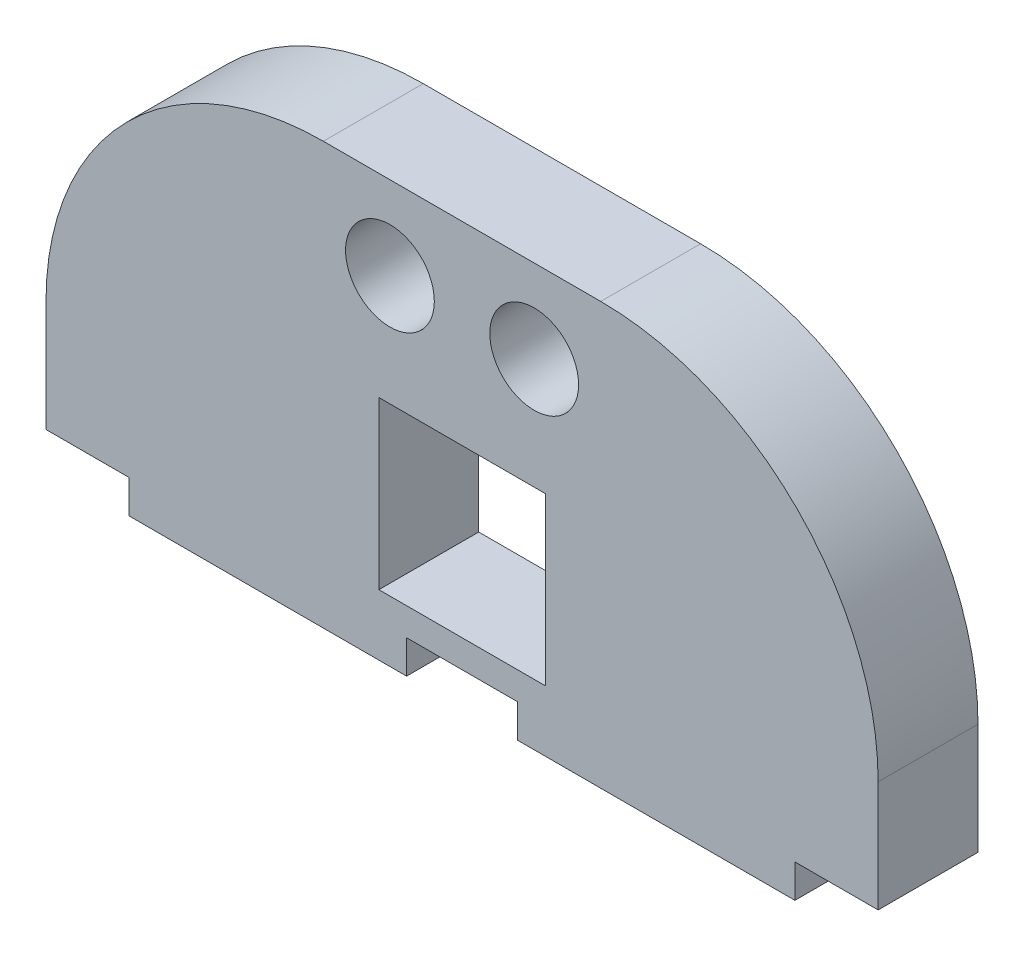
ISO-10303-21;
HEADER;
FILE_DESCRIPTION(('STEP AP214'),'2;1');
FILE_NAME('part.step','',(''),(''),'','','');
FILE_SCHEMA(('AUTOMOTIVE_DESIGN { 1 0 10303 214 1 1 1 1 }'));
ENDSEC;
DATA;
#1=APPLICATION_CONTEXT('core data for automotive mechanical design processes');
#2=APPLICATION_PROTOCOL_DEFINITION('international standard','automotive_design',2000,#1);
#3=PRODUCT_CONTEXT('',#1,'mechanical');
#4=PRODUCT('Part','Part','',(#3));
#5=PRODUCT_RELATED_PRODUCT_CATEGORY('part','',(#4));
#6=PRODUCT_DEFINITION_FORMATION('','',#4);
#7=PRODUCT_DEFINITION_CONTEXT('part definition',#1,'design');
#8=PRODUCT_DEFINITION('design','',#6,#7);
#9=PRODUCT_DEFINITION_SHAPE('','',#8);
#10=(LENGTH_UNIT() NAMED_UNIT(*) SI_UNIT(.MILLI.,.METRE.));
#11=(NAMED_UNIT(*) PLANE_ANGLE_UNIT() SI_UNIT($,.RADIAN.));
#12=(NAMED_UNIT(*) SI_UNIT($,.STERADIAN.) SOLID_ANGLE_UNIT());
#13=UNCERTAINTY_MEASURE_WITH_UNIT(LENGTH_MEASURE(1.E-05),#10,'distance_accuracy_value','');
#14=(GEOMETRIC_REPRESENTATION_CONTEXT(3) GLOBAL_UNCERTAINTY_ASSIGNED_CONTEXT((#13)) GLOBAL_UNIT_ASSIGNED_CONTEXT((#10,
#11,#12)) REPRESENTATION_CONTEXT('',''));
#15=CARTESIAN_POINT('',(0.,0.,0.));
#16=DIRECTION('',(0.,0.,1.));
#17=DIRECTION('',(1.,0.,0.));
#18=AXIS2_PLACEMENT_3D('',#15,#16,#17);
#19=CARTESIAN_POINT('',(100.,20.,18.));
#20=DIRECTION('',(0.,0.,1.));
#21=DIRECTION('',(1.,0.,0.));
#22=AXIS2_PLACEMENT_3D('',#19,#20,#21);
#23=PLANE('',#22);
#24=CARTESIAN_POINT('',(62.,55.,18.));
#25=DIRECTION('',(0.,0.,1.));
#26=DIRECTION('',(1.,0.,0.));
#27=AXIS2_PLACEMENT_3D('',#24,#25,#26);
#28=CIRCLE('',#27,8.);
#29=CARTESIAN_POINT('',(70.,55.,18.));
#30=VERTEX_POINT('',#29);
#31=EDGE_CURVE('E200',#30,#30,#28,.T.);
#32=ORIENTED_EDGE('',*,*,#31,.F.);
#33=EDGE_LOOP('',(#32));
#34=FACE_BOUND('',#33,.T.);
#35=DIRECTION('',(1.,0.,0.));
#36=VECTOR('',#35,1.);
#37=CARTESIAN_POINT('',(0.,0.,18.));
#38=LINE('',#37,#36);
#39=CARTESIAN_POINT('',(0.,0.,18.));
#40=VERTEX_POINT('',#39);
#41=CARTESIAN_POINT('',(15.,0.,18.));
#42=VERTEX_POINT('',#41);
#43=EDGE_CURVE('E216',#40,#42,#38,.T.);
#44=ORIENTED_EDGE('',*,*,#43,.T.);
#45=DIRECTION('',(0.,-1.,0.));
#46=VECTOR('',#45,1.);
#47=CARTESIAN_POINT('',(15.,0.,18.));
#48=LINE('',#47,#46);
#49=CARTESIAN_POINT('',(15.,-6.,18.));
#50=VERTEX_POINT('',#49);
#51=EDGE_CURVE('E220',#42,#50,#48,.T.);
#52=ORIENTED_EDGE('',*,*,#51,.T.);
#53=DIRECTION('',(1.,0.,0.));
#54=VECTOR('',#53,1.);
#55=CARTESIAN_POINT('',(15.,-6.,18.));
#56=LINE('',#55,#54);
#57=CARTESIAN_POINT('',(65.,-6.,18.));
#58=VERTEX_POINT('',#57);
#59=EDGE_CURVE('E224',#50,#58,#56,.T.);
#60=ORIENTED_EDGE('',*,*,#59,.T.);
#61=DIRECTION('',(0.,1.,0.));
#62=VECTOR('',#61,1.);
#63=CARTESIAN_POINT('',(65.,-6.,18.));
#64=LINE('',#63,#62);
#65=CARTESIAN_POINT('',(65.,0.,18.));
#66=VERTEX_POINT('',#65);
#67=EDGE_CURVE('E227',#58,#66,#64,.T.);
#68=ORIENTED_EDGE('',*,*,#67,.T.);
#69=DIRECTION('',(1.,0.,0.));
#70=VECTOR('',#69,1.);
#71=CARTESIAN_POINT('',(65.,0.,18.));
#72=LINE('',#71,#70);
#73=CARTESIAN_POINT('',(85.,0.,18.));
#74=VERTEX_POINT('',#73);
#75=EDGE_CURVE('E230',#66,#74,#72,.T.);
#76=ORIENTED_EDGE('',*,*,#75,.T.);
#77=DIRECTION('',(0.,-1.,0.));
#78=VECTOR('',#77,1.);
#79=CARTESIAN_POINT('',(85.,0.,18.));
#80=LINE('',#79,#78);
#81=CARTESIAN_POINT('',(85.,-6.,18.));
#82=VERTEX_POINT('',#81);
#83=EDGE_CURVE('E233',#74,#82,#80,.T.);
#84=ORIENTED_EDGE('',*,*,#83,.T.);
#85=DIRECTION('',(1.,0.,0.));
#86=VECTOR('',#85,1.);
#87=CARTESIAN_POINT('',(85.,-6.,18.));
#88=LINE('',#87,#86);
#89=CARTESIAN_POINT('',(135.,-6.,18.));
#90=VERTEX_POINT('',#89);
#91=EDGE_CURVE('E236',#82,#90,#88,.T.);
#92=ORIENTED_EDGE('',*,*,#91,.T.);
#93=DIRECTION('',(0.,1.,0.));
#94=VECTOR('',#93,1.);
#95=CARTESIAN_POINT('',(135.,-6.,18.));
#96=LINE('',#95,#94);
#97=CARTESIAN_POINT('',(135.,0.,18.));
#98=VERTEX_POINT('',#97);
#99=EDGE_CURVE('E239',#90,#98,#96,.T.);
#100=ORIENTED_EDGE('',*,*,#99,.T.);
#101=DIRECTION('',(1.,0.,0.));
#102=VECTOR('',#101,1.);
#103=CARTESIAN_POINT('',(135.,0.,18.));
#104=LINE('',#103,#102);
#105=CARTESIAN_POINT('',(150.,0.,18.));
#106=VERTEX_POINT('',#105);
#107=EDGE_CURVE('E242',#98,#106,#104,.T.);
#108=ORIENTED_EDGE('',*,*,#107,.T.);
#109=DIRECTION('',(0.,1.,0.));
#110=VECTOR('',#109,1.);
#111=CARTESIAN_POINT('',(150.,0.,18.));
#112=LINE('',#111,#110);
#113=CARTESIAN_POINT('',(150.,20.,18.));
#114=VERTEX_POINT('',#113);
#115=EDGE_CURVE('E245',#106,#114,#112,.T.);
#116=ORIENTED_EDGE('',*,*,#115,.T.);
#117=CARTESIAN_POINT('',(100.,20.,18.));
#118=DIRECTION('',(0.,0.,1.));
#119=DIRECTION('',(1.,0.,0.));
#120=AXIS2_PLACEMENT_3D('',#117,#118,#119);
#121=CIRCLE('',#120,50.);
#122=CARTESIAN_POINT('',(100.,70.,18.));
#123=VERTEX_POINT('',#122);
#124=EDGE_CURVE('E248',#114,#123,#121,.T.);
#125=ORIENTED_EDGE('',*,*,#124,.T.);
#126=DIRECTION('',(-1.,0.,0.));
#127=VECTOR('',#126,1.);
#128=CARTESIAN_POINT('',(50.,70.,18.));
#129=LINE('',#128,#127);
#130=CARTESIAN_POINT('',(50.,70.,18.));
#131=VERTEX_POINT('',#130);
#132=EDGE_CURVE('E251',#123,#131,#129,.T.);
#133=ORIENTED_EDGE('',*,*,#132,.T.);
#134=CARTESIAN_POINT('',(50.,20.,18.));
#135=DIRECTION('',(0.,0.,1.));
#136=DIRECTION('',(-1.,0.,0.));
#137=AXIS2_PLACEMENT_3D('',#134,#135,#136);
#138=CIRCLE('',#137,50.);
#139=CARTESIAN_POINT('',(0.,20.,18.));
#140=VERTEX_POINT('',#139);
#141=EDGE_CURVE('E254',#131,#140,#138,.T.);
#142=ORIENTED_EDGE('',*,*,#141,.T.);
#143=DIRECTION('',(0.,-1.,0.));
#144=VECTOR('',#143,1.);
#145=CARTESIAN_POINT('',(0.,0.,18.));
#146=LINE('',#145,#144);
#147=EDGE_CURVE('E257',#140,#40,#146,.T.);
#148=ORIENTED_EDGE('',*,*,#147,.T.);
#149=EDGE_LOOP('',(#44,#52,#60,#68,#76,#84,#92,#100,#108,#116,#125,#133,#142,#148));
#150=FACE_BOUND('',#149,.T.);
#151=DIRECTION('',(1.,0.,0.));
#152=VECTOR('',#151,1.);
#153=CARTESIAN_POINT('',(90.,5.,18.));
#154=LINE('',#153,#152);
#155=CARTESIAN_POINT('',(60.,5.,18.));
#156=VERTEX_POINT('',#155);
#157=CARTESIAN_POINT('',(90.,5.,18.));
#158=VERTEX_POINT('',#157);
#159=EDGE_CURVE('E174',#156,#158,#154,.T.);
#160=ORIENTED_EDGE('',*,*,#159,.F.);
#161=DIRECTION('',(0.,-1.,0.));
#162=VECTOR('',#161,1.);
#163=CARTESIAN_POINT('',(60.,5.,18.));
#164=LINE('',#163,#162);
#165=CARTESIAN_POINT('',(60.,35.,18.));
#166=VERTEX_POINT('',#165);
#167=EDGE_CURVE('E165',#166,#156,#164,.T.);
#168=ORIENTED_EDGE('',*,*,#167,.F.);
#169=DIRECTION('',(-1.,0.,0.));
#170=VECTOR('',#169,1.);
#171=CARTESIAN_POINT('',(60.,35.,18.));
#172=LINE('',#171,#170);
#173=CARTESIAN_POINT('',(90.,35.,18.));
#174=VERTEX_POINT('',#173);
#175=EDGE_CURVE('E192',#174,#166,#172,.T.);
#176=ORIENTED_EDGE('',*,*,#175,.F.);
#177=DIRECTION('',(0.,1.,0.));
#178=VECTOR('',#177,1.);
#179=CARTESIAN_POINT('',(90.,35.,18.));
#180=LINE('',#179,#178);
#181=EDGE_CURVE('E188',#158,#174,#180,.T.);
#182=ORIENTED_EDGE('',*,*,#181,.F.);
#183=EDGE_LOOP('',(#160,#168,#176,#182));
#184=FACE_BOUND('',#183,.T.);
#185=CARTESIAN_POINT('',(88.,55.,18.));
#186=DIRECTION('',(0.,0.,1.));
#187=DIRECTION('',(1.,0.,0.));
#188=AXIS2_PLACEMENT_3D('',#185,#186,#187);
#189=CIRCLE('',#188,8.00000000000001);
#190=CARTESIAN_POINT('',(96.,55.,18.));
#191=VERTEX_POINT('',#190);
#192=EDGE_CURVE('E607',#191,#191,#189,.T.);
#193=ORIENTED_EDGE('',*,*,#192,.F.);
#194=EDGE_LOOP('',(#193));
#195=FACE_BOUND('',#194,.T.);
#196=ADVANCED_FACE('F39',(#34,#150,#184,#195),#23,.T.);
#197=CARTESIAN_POINT('',(100.,20.,0.));
#198=DIRECTION('',(0.,0.,1.));
#199=DIRECTION('',(1.,0.,0.));
#200=AXIS2_PLACEMENT_3D('',#197,#198,#199);
#201=PLANE('',#200);
#202=DIRECTION('',(1.,0.,0.));
#203=VECTOR('',#202,1.);
#204=CARTESIAN_POINT('',(0.,0.,0.));
#205=LINE('',#204,#203);
#206=CARTESIAN_POINT('',(0.,0.,0.));
#207=VERTEX_POINT('',#206);
#208=CARTESIAN_POINT('',(15.,0.,0.));
#209=VERTEX_POINT('',#208);
#210=EDGE_CURVE('E183',#207,#209,#205,.T.);
#211=ORIENTED_EDGE('',*,*,#210,.F.);
#212=DIRECTION('',(0.,-1.,0.));
#213=VECTOR('',#212,1.);
#214=CARTESIAN_POINT('',(0.,0.,0.));
#215=LINE('',#214,#213);
#216=CARTESIAN_POINT('',(0.,20.,0.));
#217=VERTEX_POINT('',#216);
#218=EDGE_CURVE('E221',#217,#207,#215,.T.);
#219=ORIENTED_EDGE('',*,*,#218,.F.);
#220=CARTESIAN_POINT('',(50.,20.,0.));
#221=DIRECTION('',(0.,0.,1.));
#222=DIRECTION('',(-1.,0.,0.));
#223=AXIS2_PLACEMENT_3D('',#220,#221,#222);
#224=CIRCLE('',#223,50.);
#225=CARTESIAN_POINT('',(50.,70.,0.));
#226=VERTEX_POINT('',#225);
#227=EDGE_CURVE('E297',#226,#217,#224,.T.);
#228=ORIENTED_EDGE('',*,*,#227,.F.);
#229=DIRECTION('',(-1.,0.,0.));
#230=VECTOR('',#229,1.);
#231=CARTESIAN_POINT('',(50.,70.,0.));
#232=LINE('',#231,#230);
#233=CARTESIAN_POINT('',(100.,70.,0.));
#234=VERTEX_POINT('',#233);
#235=EDGE_CURVE('E294',#234,#226,#232,.T.);
#236=ORIENTED_EDGE('',*,*,#235,.F.);
#237=CARTESIAN_POINT('',(100.,20.,0.));
#238=DIRECTION('',(0.,0.,1.));
#239=DIRECTION('',(1.,0.,0.));
#240=AXIS2_PLACEMENT_3D('',#237,#238,#239);
#241=CIRCLE('',#240,50.);
#242=CARTESIAN_POINT('',(150.,20.,0.));
#243=VERTEX_POINT('',#242);
#244=EDGE_CURVE('E291',#243,#234,#241,.T.);
#245=ORIENTED_EDGE('',*,*,#244,.F.);
#246=DIRECTION('',(0.,1.,0.));
#247=VECTOR('',#246,1.);
#248=CARTESIAN_POINT('',(150.,0.,0.));
#249=LINE('',#248,#247);
#250=CARTESIAN_POINT('',(150.,0.,0.));
#251=VERTEX_POINT('',#250);
#252=EDGE_CURVE('E288',#251,#243,#249,.T.);
#253=ORIENTED_EDGE('',*,*,#252,.F.);
#254=DIRECTION('',(1.,0.,0.));
#255=VECTOR('',#254,1.);
#256=CARTESIAN_POINT('',(135.,0.,0.));
#257=LINE('',#256,#255);
#258=CARTESIAN_POINT('',(135.,0.,0.));
#259=VERTEX_POINT('',#258);
#260=EDGE_CURVE('E285',#259,#251,#257,.T.);
#261=ORIENTED_EDGE('',*,*,#260,.F.);
#262=DIRECTION('',(0.,1.,0.));
#263=VECTOR('',#262,1.);
#264=CARTESIAN_POINT('',(135.,-6.,0.));
#265=LINE('',#264,#263);
#266=CARTESIAN_POINT('',(135.,-6.,0.));
#267=VERTEX_POINT('',#266);
#268=EDGE_CURVE('E282',#267,#259,#265,.T.);
#269=ORIENTED_EDGE('',*,*,#268,.F.);
#270=DIRECTION('',(1.,0.,0.));
#271=VECTOR('',#270,1.);
#272=CARTESIAN_POINT('',(85.,-6.,0.));
#273=LINE('',#272,#271);
#274=CARTESIAN_POINT('',(85.,-6.,0.));
#275=VERTEX_POINT('',#274);
#276=EDGE_CURVE('E279',#275,#267,#273,.T.);
#277=ORIENTED_EDGE('',*,*,#276,.F.);
#278=DIRECTION('',(0.,-1.,0.));
#279=VECTOR('',#278,1.);
#280=CARTESIAN_POINT('',(85.,0.,0.));
#281=LINE('',#280,#279);
#282=CARTESIAN_POINT('',(85.,0.,0.));
#283=VERTEX_POINT('',#282);
#284=EDGE_CURVE('E276',#283,#275,#281,.T.);
#285=ORIENTED_EDGE('',*,*,#284,.F.);
#286=DIRECTION('',(1.,0.,0.));
#287=VECTOR('',#286,1.);
#288=CARTESIAN_POINT('',(65.,0.,0.));
#289=LINE('',#288,#287);
#290=CARTESIAN_POINT('',(65.,0.,0.));
#291=VERTEX_POINT('',#290);
#292=EDGE_CURVE('E273',#291,#283,#289,.T.);
#293=ORIENTED_EDGE('',*,*,#292,.F.);
#294=DIRECTION('',(0.,1.,0.));
#295=VECTOR('',#294,1.);
#296=CARTESIAN_POINT('',(65.,-6.,0.));
#297=LINE('',#296,#295);
#298=CARTESIAN_POINT('',(65.,-6.,0.));
#299=VERTEX_POINT('',#298);
#300=EDGE_CURVE('E270',#299,#291,#297,.T.);
#301=ORIENTED_EDGE('',*,*,#300,.F.);
#302=DIRECTION('',(1.,0.,0.));
#303=VECTOR('',#302,1.);
#304=CARTESIAN_POINT('',(15.,-6.,0.));
#305=LINE('',#304,#303);
#306=CARTESIAN_POINT('',(15.,-6.,0.));
#307=VERTEX_POINT('',#306);
#308=EDGE_CURVE('E267',#307,#299,#305,.T.);
#309=ORIENTED_EDGE('',*,*,#308,.F.);
#310=DIRECTION('',(0.,-1.,0.));
#311=VECTOR('',#310,1.);
#312=CARTESIAN_POINT('',(15.,0.,0.));
#313=LINE('',#312,#311);
#314=EDGE_CURVE('E264',#209,#307,#313,.T.);
#315=ORIENTED_EDGE('',*,*,#314,.F.);
#316=EDGE_LOOP('',(#211,#219,#228,#236,#245,#253,#261,#269,#277,#285,#293,#301,#309,#315));
#317=FACE_BOUND('',#316,.T.);
#318=DIRECTION('',(0.,-1.,0.));
#319=VECTOR('',#318,1.);
#320=CARTESIAN_POINT('',(60.,5.,0.));
#321=LINE('',#320,#319);
#322=CARTESIAN_POINT('',(60.,35.,0.));
#323=VERTEX_POINT('',#322);
#324=CARTESIAN_POINT('',(60.,5.,0.));
#325=VERTEX_POINT('',#324);
#326=EDGE_CURVE('E63',#323,#325,#321,.T.);
#327=ORIENTED_EDGE('',*,*,#326,.T.);
#328=DIRECTION('',(1.,0.,0.));
#329=VECTOR('',#328,1.);
#330=CARTESIAN_POINT('',(90.,5.,0.));
#331=LINE('',#330,#329);
#332=CARTESIAN_POINT('',(90.,5.,0.));
#333=VERTEX_POINT('',#332);
#334=EDGE_CURVE('E181',#325,#333,#331,.T.);
#335=ORIENTED_EDGE('',*,*,#334,.T.);
#336=DIRECTION('',(0.,1.,0.));
#337=VECTOR('',#336,1.);
#338=CARTESIAN_POINT('',(90.,35.,0.));
#339=LINE('',#338,#337);
#340=CARTESIAN_POINT('',(90.,35.,0.));
#341=VERTEX_POINT('',#340);
#342=EDGE_CURVE('E203',#333,#341,#339,.T.);
#343=ORIENTED_EDGE('',*,*,#342,.T.);
#344=DIRECTION('',(-1.,0.,0.));
#345=VECTOR('',#344,1.);
#346=CARTESIAN_POINT('',(60.,35.,0.));
#347=LINE('',#346,#345);
#348=EDGE_CURVE('E175',#341,#323,#347,.T.);
#349=ORIENTED_EDGE('',*,*,#348,.T.);
#350=EDGE_LOOP('',(#327,#335,#343,#349));
#351=FACE_BOUND('',#350,.T.);
#352=CARTESIAN_POINT('',(62.,55.,0.));
#353=DIRECTION('',(0.,0.,1.));
#354=DIRECTION('',(1.,0.,0.));
#355=AXIS2_PLACEMENT_3D('',#352,#353,#354);
#356=CIRCLE('',#355,8.);
#357=CARTESIAN_POINT('',(70.,55.,0.));
#358=VERTEX_POINT('',#357);
#359=EDGE_CURVE('E615',#358,#358,#356,.T.);
#360=ORIENTED_EDGE('',*,*,#359,.T.);
#361=EDGE_LOOP('',(#360));
#362=FACE_BOUND('',#361,.T.);
#363=CARTESIAN_POINT('',(88.,55.,0.));
#364=DIRECTION('',(0.,0.,1.));
#365=DIRECTION('',(1.,0.,0.));
#366=AXIS2_PLACEMENT_3D('',#363,#364,#365);
#367=CIRCLE('',#366,8.00000000000001);
#368=CARTESIAN_POINT('',(96.,55.,0.));
#369=VERTEX_POINT('',#368);
#370=EDGE_CURVE('E610',#369,#369,#367,.T.);
#371=ORIENTED_EDGE('',*,*,#370,.T.);
#372=EDGE_LOOP('',(#371));
#373=FACE_BOUND('',#372,.T.);
#374=ADVANCED_FACE('F360',(#317,#351,#362,#373),#201,.F.);
#375=CARTESIAN_POINT('',(0.,0.,18.));
#376=DIRECTION('',(0.,1.,0.));
#377=DIRECTION('',(0.,0.,1.));
#378=AXIS2_PLACEMENT_3D('',#375,#376,#377);
#379=PLANE('',#378);
#380=ORIENTED_EDGE('',*,*,#210,.T.);
#381=DIRECTION('',(0.,0.,-1.));
#382=VECTOR('',#381,1.);
#383=CARTESIAN_POINT('',(15.,0.,18.));
#384=LINE('',#383,#382);
#385=EDGE_CURVE('E11',#42,#209,#384,.T.);
#386=ORIENTED_EDGE('',*,*,#385,.F.);
#387=ORIENTED_EDGE('',*,*,#43,.F.);
#388=DIRECTION('',(0.,0.,-1.));
#389=VECTOR('',#388,1.);
#390=CARTESIAN_POINT('',(0.,0.,18.));
#391=LINE('',#390,#389);
#392=EDGE_CURVE('E260',#40,#207,#391,.T.);
#393=ORIENTED_EDGE('',*,*,#392,.T.);
#394=EDGE_LOOP('',(#380,#386,#387,#393));
#395=FACE_BOUND('',#394,.T.);
#396=ADVANCED_FACE('F41',(#395),#379,.F.);
#397=CARTESIAN_POINT('',(15.,0.,18.));
#398=DIRECTION('',(1.,0.,0.));
#399=DIRECTION('',(0.,0.,-1.));
#400=AXIS2_PLACEMENT_3D('',#397,#398,#399);
#401=PLANE('',#400);
#402=ORIENTED_EDGE('',*,*,#314,.T.);
#403=DIRECTION('',(0.,0.,-1.));
#404=VECTOR('',#403,1.);
#405=CARTESIAN_POINT('',(15.,-6.,18.));
#406=LINE('',#405,#404);
#407=EDGE_CURVE('E48',#50,#307,#406,.T.);
#408=ORIENTED_EDGE('',*,*,#407,.F.);
#409=ORIENTED_EDGE('',*,*,#51,.F.);
#410=ORIENTED_EDGE('',*,*,#385,.T.);
#411=EDGE_LOOP('',(#402,#408,#409,#410));
#412=FACE_BOUND('',#411,.T.);
#413=ADVANCED_FACE('F377',(#412),#401,.F.);
#414=CARTESIAN_POINT('',(15.,-6.,18.));
#415=DIRECTION('',(0.,1.,0.));
#416=DIRECTION('',(0.,0.,1.));
#417=AXIS2_PLACEMENT_3D('',#414,#415,#416);
#418=PLANE('',#417);
#419=ORIENTED_EDGE('',*,*,#308,.T.);
#420=DIRECTION('',(0.,0.,-1.));
#421=VECTOR('',#420,1.);
#422=CARTESIAN_POINT('',(65.,-6.,18.));
#423=LINE('',#422,#421);
#424=EDGE_CURVE('E345',#58,#299,#423,.T.);
#425=ORIENTED_EDGE('',*,*,#424,.F.);
#426=ORIENTED_EDGE('',*,*,#59,.F.);
#427=ORIENTED_EDGE('',*,*,#407,.T.);
#428=EDGE_LOOP('',(#419,#425,#426,#427));
#429=FACE_BOUND('',#428,.T.);
#430=ADVANCED_FACE('F354',(#429),#418,.F.);
#431=CARTESIAN_POINT('',(65.,-6.,18.));
#432=DIRECTION('',(-1.,0.,0.));
#433=DIRECTION('',(0.,0.,1.));
#434=AXIS2_PLACEMENT_3D('',#431,#432,#433);
#435=PLANE('',#434);
#436=ORIENTED_EDGE('',*,*,#300,.T.);
#437=DIRECTION('',(0.,0.,-1.));
#438=VECTOR('',#437,1.);
#439=CARTESIAN_POINT('',(65.,0.,18.));
#440=LINE('',#439,#438);
#441=EDGE_CURVE('E341',#66,#291,#440,.T.);
#442=ORIENTED_EDGE('',*,*,#441,.F.);
#443=ORIENTED_EDGE('',*,*,#67,.F.);
#444=ORIENTED_EDGE('',*,*,#424,.T.);
#445=EDGE_LOOP('',(#436,#442,#443,#444));
#446=FACE_BOUND('',#445,.T.);
#447=ADVANCED_FACE('F366',(#446),#435,.F.);
#448=CARTESIAN_POINT('',(65.,0.,18.));
#449=DIRECTION('',(0.,1.,0.));
#450=DIRECTION('',(0.,0.,1.));
#451=AXIS2_PLACEMENT_3D('',#448,#449,#450);
#452=PLANE('',#451);
#453=ORIENTED_EDGE('',*,*,#292,.T.);
#454=DIRECTION('',(0.,0.,-1.));
#455=VECTOR('',#454,1.);
#456=CARTESIAN_POINT('',(85.,0.,18.));
#457=LINE('',#456,#455);
#458=EDGE_CURVE('E337',#74,#283,#457,.T.);
#459=ORIENTED_EDGE('',*,*,#458,.F.);
#460=ORIENTED_EDGE('',*,*,#75,.F.);
#461=ORIENTED_EDGE('',*,*,#441,.T.);
#462=EDGE_LOOP('',(#453,#459,#460,#461));
#463=FACE_BOUND('',#462,.T.);
#464=ADVANCED_FACE('F370',(#463),#452,.F.);
#465=CARTESIAN_POINT('',(85.,0.,18.));
#466=DIRECTION('',(1.,0.,0.));
#467=DIRECTION('',(0.,0.,-1.));
#468=AXIS2_PLACEMENT_3D('',#465,#466,#467);
#469=PLANE('',#468);
#470=ORIENTED_EDGE('',*,*,#284,.T.);
#471=DIRECTION('',(0.,0.,-1.));
#472=VECTOR('',#471,1.);
#473=CARTESIAN_POINT('',(85.,-6.,18.));
#474=LINE('',#473,#472);
#475=EDGE_CURVE('E333',#82,#275,#474,.T.);
#476=ORIENTED_EDGE('',*,*,#475,.F.);
#477=ORIENTED_EDGE('',*,*,#83,.F.);
#478=ORIENTED_EDGE('',*,*,#458,.T.);
#479=EDGE_LOOP('',(#470,#476,#477,#478));
#480=FACE_BOUND('',#479,.T.);
#481=ADVANCED_FACE('F420',(#480),#469,.F.);
#482=CARTESIAN_POINT('',(85.,-6.,18.));
#483=DIRECTION('',(0.,1.,0.));
#484=DIRECTION('',(0.,0.,1.));
#485=AXIS2_PLACEMENT_3D('',#482,#483,#484);
#486=PLANE('',#485);
#487=ORIENTED_EDGE('',*,*,#276,.T.);
#488=DIRECTION('',(0.,0.,-1.));
#489=VECTOR('',#488,1.);
#490=CARTESIAN_POINT('',(135.,-6.,18.));
#491=LINE('',#490,#489);
#492=EDGE_CURVE('E329',#90,#267,#491,.T.);
#493=ORIENTED_EDGE('',*,*,#492,.F.);
#494=ORIENTED_EDGE('',*,*,#91,.F.);
#495=ORIENTED_EDGE('',*,*,#475,.T.);
#496=EDGE_LOOP('',(#487,#493,#494,#495));
#497=FACE_BOUND('',#496,.T.);
#498=ADVANCED_FACE('F418',(#497),#486,.F.);
#499=CARTESIAN_POINT('',(135.,-6.,18.));
#500=DIRECTION('',(-1.,0.,0.));
#501=DIRECTION('',(0.,0.,1.));
#502=AXIS2_PLACEMENT_3D('',#499,#500,#501);
#503=PLANE('',#502);
#504=ORIENTED_EDGE('',*,*,#268,.T.);
#505=DIRECTION('',(0.,0.,-1.));
#506=VECTOR('',#505,1.);
#507=CARTESIAN_POINT('',(135.,0.,18.));
#508=LINE('',#507,#506);
#509=EDGE_CURVE('E325',#98,#259,#508,.T.);
#510=ORIENTED_EDGE('',*,*,#509,.F.);
#511=ORIENTED_EDGE('',*,*,#99,.F.);
#512=ORIENTED_EDGE('',*,*,#492,.T.);
#513=EDGE_LOOP('',(#504,#510,#511,#512));
#514=FACE_BOUND('',#513,.T.);
#515=ADVANCED_FACE('F413',(#514),#503,.F.);
#516=CARTESIAN_POINT('',(135.,0.,18.));
#517=DIRECTION('',(0.,1.,0.));
#518=DIRECTION('',(-1.,0.,0.));
#519=AXIS2_PLACEMENT_3D('',#516,#517,#518);
#520=PLANE('',#519);
#521=ORIENTED_EDGE('',*,*,#260,.T.);
#522=DIRECTION('',(0.,0.,-1.));
#523=VECTOR('',#522,1.);
#524=CARTESIAN_POINT('',(150.,0.,18.));
#525=LINE('',#524,#523);
#526=EDGE_CURVE('E321',#106,#251,#525,.T.);
#527=ORIENTED_EDGE('',*,*,#526,.F.);
#528=ORIENTED_EDGE('',*,*,#107,.F.);
#529=ORIENTED_EDGE('',*,*,#509,.T.);
#530=EDGE_LOOP('',(#521,#527,#528,#529));
#531=FACE_BOUND('',#530,.T.);
#532=ADVANCED_FACE('F408',(#531),#520,.F.);
#533=CARTESIAN_POINT('',(150.,0.,18.));
#534=DIRECTION('',(-1.,0.,0.));
#535=DIRECTION('',(0.,0.,1.));
#536=AXIS2_PLACEMENT_3D('',#533,#534,#535);
#537=PLANE('',#536);
#538=ORIENTED_EDGE('',*,*,#252,.T.);
#539=DIRECTION('',(0.,0.,-1.));
#540=VECTOR('',#539,1.);
#541=CARTESIAN_POINT('',(150.,20.,18.));
#542=LINE('',#541,#540);
#543=EDGE_CURVE('E317',#114,#243,#542,.T.);
#544=ORIENTED_EDGE('',*,*,#543,.F.);
#545=ORIENTED_EDGE('',*,*,#115,.F.);
#546=ORIENTED_EDGE('',*,*,#526,.T.);
#547=EDGE_LOOP('',(#538,#544,#545,#546));
#548=FACE_BOUND('',#547,.T.);
#549=ADVANCED_FACE('F404',(#548),#537,.F.);
#550=CARTESIAN_POINT('',(100.,20.,18.));
#551=DIRECTION('',(0.,0.,-1.));
#552=DIRECTION('',(-1.,0.,0.));
#553=AXIS2_PLACEMENT_3D('',#550,#551,#552);
#554=CYLINDRICAL_SURFACE('',#553,50.);
#555=ORIENTED_EDGE('',*,*,#244,.T.);
#556=DIRECTION('',(0.,0.,-1.));
#557=VECTOR('',#556,1.);
#558=CARTESIAN_POINT('',(100.,70.,18.));
#559=LINE('',#558,#557);
#560=EDGE_CURVE('E313',#123,#234,#559,.T.);
#561=ORIENTED_EDGE('',*,*,#560,.F.);
#562=ORIENTED_EDGE('',*,*,#124,.F.);
#563=ORIENTED_EDGE('',*,*,#543,.T.);
#564=EDGE_LOOP('',(#555,#561,#562,#563));
#565=FACE_BOUND('',#564,.T.);
#566=ADVANCED_FACE('F399',(#565),#554,.T.);
#567=CARTESIAN_POINT('',(50.,70.,18.));
#568=DIRECTION('',(0.,-1.,0.));
#569=DIRECTION('',(0.,0.,-1.));
#570=AXIS2_PLACEMENT_3D('',#567,#568,#569);
#571=PLANE('',#570);
#572=ORIENTED_EDGE('',*,*,#235,.T.);
#573=DIRECTION('',(0.,0.,-1.));
#574=VECTOR('',#573,1.);
#575=CARTESIAN_POINT('',(50.,70.,18.));
#576=LINE('',#575,#574);
#577=EDGE_CURVE('E309',#131,#226,#576,.T.);
#578=ORIENTED_EDGE('',*,*,#577,.F.);
#579=ORIENTED_EDGE('',*,*,#132,.F.);
#580=ORIENTED_EDGE('',*,*,#560,.T.);
#581=EDGE_LOOP('',(#572,#578,#579,#580));
#582=FACE_BOUND('',#581,.T.);
#583=ADVANCED_FACE('F393',(#582),#571,.F.);
#584=CARTESIAN_POINT('',(50.,20.,18.));
#585=DIRECTION('',(0.,0.,-1.));
#586=DIRECTION('',(-1.,0.,0.));
#587=AXIS2_PLACEMENT_3D('',#584,#585,#586);
#588=CYLINDRICAL_SURFACE('',#587,50.);
#589=ORIENTED_EDGE('',*,*,#227,.T.);
#590=DIRECTION('',(0.,0.,-1.));
#591=VECTOR('',#590,1.);
#592=CARTESIAN_POINT('',(0.,20.,18.));
#593=LINE('',#592,#591);
#594=EDGE_CURVE('E305',#140,#217,#593,.T.);
#595=ORIENTED_EDGE('',*,*,#594,.F.);
#596=ORIENTED_EDGE('',*,*,#141,.F.);
#597=ORIENTED_EDGE('',*,*,#577,.T.);
#598=EDGE_LOOP('',(#589,#595,#596,#597));
#599=FACE_BOUND('',#598,.T.);
#600=ADVANCED_FACE('F389',(#599),#588,.T.);
#601=CARTESIAN_POINT('',(0.,0.,18.));
#602=DIRECTION('',(1.,0.,0.));
#603=DIRECTION('',(0.,0.,-1.));
#604=AXIS2_PLACEMENT_3D('',#601,#602,#603);
#605=PLANE('',#604);
#606=ORIENTED_EDGE('',*,*,#218,.T.);
#607=ORIENTED_EDGE('',*,*,#392,.F.);
#608=ORIENTED_EDGE('',*,*,#147,.F.);
#609=ORIENTED_EDGE('',*,*,#594,.T.);
#610=EDGE_LOOP('',(#606,#607,#608,#609));
#611=FACE_BOUND('',#610,.T.);
#612=ADVANCED_FACE('F384',(#611),#605,.F.);
#613=CARTESIAN_POINT('',(60.,5.,18.));
#614=DIRECTION('',(1.,0.,0.));
#615=DIRECTION('',(0.,0.,-1.));
#616=AXIS2_PLACEMENT_3D('',#613,#614,#615);
#617=PLANE('',#616);
#618=ORIENTED_EDGE('',*,*,#326,.F.);
#619=DIRECTION('',(0.,0.,-1.));
#620=VECTOR('',#619,1.);
#621=CARTESIAN_POINT('',(60.,35.,18.));
#622=LINE('',#621,#620);
#623=EDGE_CURVE('E169',#166,#323,#622,.T.);
#624=ORIENTED_EDGE('',*,*,#623,.F.);
#625=ORIENTED_EDGE('',*,*,#167,.T.);
#626=DIRECTION('',(0.,0.,-1.));
#627=VECTOR('',#626,1.);
#628=CARTESIAN_POINT('',(60.,5.,18.));
#629=LINE('',#628,#627);
#630=EDGE_CURVE('E168',#156,#325,#629,.T.);
#631=ORIENTED_EDGE('',*,*,#630,.T.);
#632=EDGE_LOOP('',(#618,#624,#625,#631));
#633=FACE_BOUND('',#632,.T.);
#634=ADVANCED_FACE('F167',(#633),#617,.T.);
#635=CARTESIAN_POINT('',(90.,5.,18.));
#636=DIRECTION('',(0.,1.,0.));
#637=DIRECTION('',(-1.,0.,0.));
#638=AXIS2_PLACEMENT_3D('',#635,#636,#637);
#639=PLANE('',#638);
#640=ORIENTED_EDGE('',*,*,#334,.F.);
#641=ORIENTED_EDGE('',*,*,#630,.F.);
#642=ORIENTED_EDGE('',*,*,#159,.T.);
#643=DIRECTION('',(0.,0.,-1.));
#644=VECTOR('',#643,1.);
#645=CARTESIAN_POINT('',(90.,5.,18.));
#646=LINE('',#645,#644);
#647=EDGE_CURVE('E184',#158,#333,#646,.T.);
#648=ORIENTED_EDGE('',*,*,#647,.T.);
#649=EDGE_LOOP('',(#640,#641,#642,#648));
#650=FACE_BOUND('',#649,.T.);
#651=ADVANCED_FACE('F178',(#650),#639,.T.);
#652=CARTESIAN_POINT('',(90.,35.,18.));
#653=DIRECTION('',(-1.,0.,0.));
#654=DIRECTION('',(0.,-1.,0.));
#655=AXIS2_PLACEMENT_3D('',#652,#653,#654);
#656=PLANE('',#655);
#657=ORIENTED_EDGE('',*,*,#342,.F.);
#658=ORIENTED_EDGE('',*,*,#647,.F.);
#659=ORIENTED_EDGE('',*,*,#181,.T.);
#660=DIRECTION('',(0.,0.,-1.));
#661=VECTOR('',#660,1.);
#662=CARTESIAN_POINT('',(90.,35.,18.));
#663=LINE('',#662,#661);
#664=EDGE_CURVE('E55',#174,#341,#663,.T.);
#665=ORIENTED_EDGE('',*,*,#664,.T.);
#666=EDGE_LOOP('',(#657,#658,#659,#665));
#667=FACE_BOUND('',#666,.T.);
#668=ADVANCED_FACE('F492',(#667),#656,.T.);
#669=CARTESIAN_POINT('',(60.,35.,18.));
#670=DIRECTION('',(0.,-1.,0.));
#671=DIRECTION('',(1.,0.,0.));
#672=AXIS2_PLACEMENT_3D('',#669,#670,#671);
#673=PLANE('',#672);
#674=ORIENTED_EDGE('',*,*,#348,.F.);
#675=ORIENTED_EDGE('',*,*,#664,.F.);
#676=ORIENTED_EDGE('',*,*,#175,.T.);
#677=ORIENTED_EDGE('',*,*,#623,.T.);
#678=EDGE_LOOP('',(#674,#675,#676,#677));
#679=FACE_BOUND('',#678,.T.);
#680=ADVANCED_FACE('F498',(#679),#673,.T.);
#681=CARTESIAN_POINT('',(62.,55.,18.));
#682=DIRECTION('',(0.,0.,-1.));
#683=DIRECTION('',(-1.,0.,0.));
#684=AXIS2_PLACEMENT_3D('',#681,#682,#683);
#685=CYLINDRICAL_SURFACE('',#684,8.);
#686=ORIENTED_EDGE('',*,*,#31,.T.);
#687=EDGE_LOOP('',(#686));
#688=FACE_BOUND('',#687,.T.);
#689=ORIENTED_EDGE('',*,*,#359,.F.);
#690=EDGE_LOOP('',(#689));
#691=FACE_BOUND('',#690,.T.);
#692=ADVANCED_FACE('F506',(#688,#691),#685,.F.);
#693=CARTESIAN_POINT('',(88.,55.,18.));
#694=DIRECTION('',(0.,0.,-1.));
#695=DIRECTION('',(-1.,0.,0.));
#696=AXIS2_PLACEMENT_3D('',#693,#694,#695);
#697=CYLINDRICAL_SURFACE('',#696,8.00000000000001);
#698=ORIENTED_EDGE('',*,*,#192,.T.);
#699=EDGE_LOOP('',(#698));
#700=FACE_BOUND('',#699,.T.);
#701=ORIENTED_EDGE('',*,*,#370,.F.);
#702=EDGE_LOOP('',(#701));
#703=FACE_BOUND('',#702,.T.);
#704=ADVANCED_FACE('F513',(#700,#703),#697,.F.);
#705=CLOSED_SHELL('',(#196,#374,#396,#413,#430,#447,#464,#481,#498,#515,#532,#549,#566,#583,
#600,#612,#634,#651,#668,#680,#692,#704));
#706=MANIFOLD_SOLID_BREP('B2',#705);
#707=ADVANCED_BREP_SHAPE_REPRESENTATION('',(#18,#706),#14);
#708=SHAPE_DEFINITION_REPRESENTATION(#9,#707);
ENDSEC;
END-ISO-10303-21;
